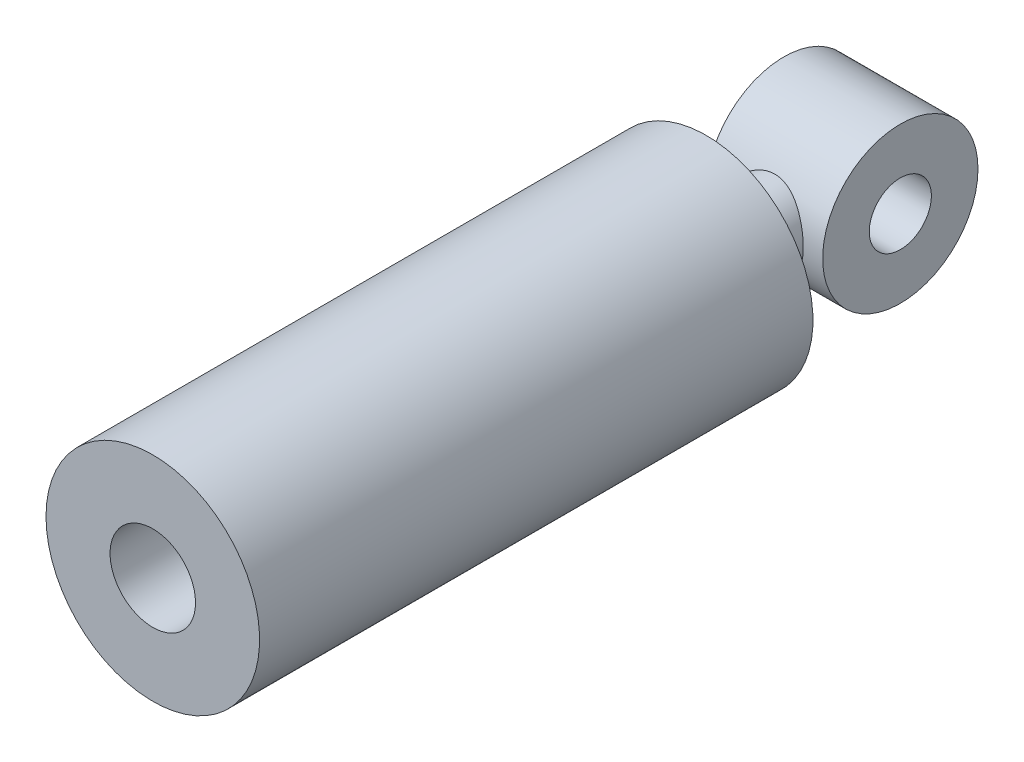
ISO-10303-21;
HEADER;
FILE_DESCRIPTION(('STEP AP214'),'2;1');
FILE_NAME('part.step','',(''),(''),'','','');
FILE_SCHEMA(('AUTOMOTIVE_DESIGN { 1 0 10303 214 1 1 1 1 }'));
ENDSEC;
DATA;
#1=APPLICATION_CONTEXT('core data for automotive mechanical design processes');
#2=APPLICATION_PROTOCOL_DEFINITION('international standard','automotive_design',2000,#1);
#3=PRODUCT_CONTEXT('',#1,'mechanical');
#4=PRODUCT('Part','Part','',(#3));
#5=PRODUCT_RELATED_PRODUCT_CATEGORY('part','',(#4));
#6=PRODUCT_DEFINITION_FORMATION('','',#4);
#7=PRODUCT_DEFINITION_CONTEXT('part definition',#1,'design');
#8=PRODUCT_DEFINITION('design','',#6,#7);
#9=PRODUCT_DEFINITION_SHAPE('','',#8);
#10=(LENGTH_UNIT() NAMED_UNIT(*) SI_UNIT(.MILLI.,.METRE.));
#11=(NAMED_UNIT(*) PLANE_ANGLE_UNIT() SI_UNIT($,.RADIAN.));
#12=(NAMED_UNIT(*) SI_UNIT($,.STERADIAN.) SOLID_ANGLE_UNIT());
#13=UNCERTAINTY_MEASURE_WITH_UNIT(LENGTH_MEASURE(1.E-05),#10,'distance_accuracy_value','');
#14=(GEOMETRIC_REPRESENTATION_CONTEXT(3) GLOBAL_UNCERTAINTY_ASSIGNED_CONTEXT((#13)) GLOBAL_UNIT_ASSIGNED_CONTEXT((#10,
#11,#12)) REPRESENTATION_CONTEXT('',''));
#15=CARTESIAN_POINT('',(0.,0.,0.));
#16=DIRECTION('',(0.,0.,1.));
#17=DIRECTION('',(1.,0.,0.));
#18=AXIS2_PLACEMENT_3D('',#15,#16,#17);
#19=CARTESIAN_POINT('',(0.,0.,9.));
#20=DIRECTION('',(0.,0.,-1.));
#21=DIRECTION('',(-1.,0.,0.));
#22=AXIS2_PLACEMENT_3D('',#19,#20,#21);
#23=CYLINDRICAL_SURFACE('',#22,2.);
#24=CARTESIAN_POINT('',(0.,0.,7.));
#25=DIRECTION('',(0.,0.,1.));
#26=DIRECTION('',(1.,0.,0.));
#27=AXIS2_PLACEMENT_3D('',#24,#25,#26);
#28=CIRCLE('',#27,2.);
#29=CARTESIAN_POINT('',(2.,0.,7.));
#30=VERTEX_POINT('',#29);
#31=EDGE_CURVE('E49',#30,#30,#28,.F.);
#32=ORIENTED_EDGE('',*,*,#31,.T.);
#33=EDGE_LOOP('',(#32));
#34=FACE_BOUND('',#33,.T.);
#35=CARTESIAN_POINT('',(-2.,0.,4.));
#36=CARTESIAN_POINT('',(-1.99999339536562,0.105143925902467,3.99999426810082));
#37=CARTESIAN_POINT('',(-1.99165985375789,0.210413199395125,3.99580982039513));
#38=CARTESIAN_POINT('',(-1.95869423931692,0.417840470537792,3.97948312074314));
#39=CARTESIAN_POINT('',(-1.93403121400437,0.519992173427259,3.96732575657839));
#40=CARTESIAN_POINT('',(-1.86961238276674,0.717867089760898,3.93632558806751));
#41=CARTESIAN_POINT('',(-1.82991523150406,0.813613605878292,3.91750878355075));
#42=CARTESIAN_POINT('',(-1.73685875727003,0.996945233613197,3.87491553031523));
#43=CARTESIAN_POINT('',(-1.68350051150227,1.08453098798012,3.8511394726705));
#44=CARTESIAN_POINT('',(-1.56096550102943,1.25501563552382,3.79912516516124));
#45=CARTESIAN_POINT('',(-1.49102704152072,1.33731042224422,3.77070398255074));
#46=CARTESIAN_POINT('',(-1.33895704150593,1.48955888973396,3.71319940493486));
#47=CARTESIAN_POINT('',(-1.25681629645512,1.55950316621353,3.68411552418069));
#48=CARTESIAN_POINT('',(-1.07503330095324,1.69050400090056,3.62597902394695));
#49=CARTESIAN_POINT('',(-0.974527803308175,1.75045067110327,3.59710373940264));
#50=CARTESIAN_POINT('',(-0.763265328027571,1.85233645378139,3.54571957544641));
#51=CARTESIAN_POINT('',(-0.652515742554502,1.89428842993267,3.52320615213979));
#52=CARTESIAN_POINT('',(-0.430669789156155,1.95626488437718,3.48915734075617));
#53=CARTESIAN_POINT('',(-0.319991095865212,1.97745171416088,3.47704543167427));
#54=CARTESIAN_POINT('',(-0.0960423244410465,2.00085398661769,3.46363779897055));
#55=CARTESIAN_POINT('',(0.0172250817423094,2.00308817674615,3.46233138686576));
#56=CARTESIAN_POINT('',(0.228572048630736,1.98937457434459,3.47021860514497));
#57=CARTESIAN_POINT('',(0.3268480624461,1.97556911907364,3.47817527324027));
#58=CARTESIAN_POINT('',(0.519443818746084,1.93387969811386,3.50152457467701));
#59=CARTESIAN_POINT('',(0.613762290610631,1.9059912477953,3.51691957663553));
#60=CARTESIAN_POINT('',(0.798458265131319,1.83641956077201,3.55374952825482));
#61=CARTESIAN_POINT('',(0.888692797571578,1.79443013423199,3.57531681327997));
#62=CARTESIAN_POINT('',(1.06126858518002,1.698083375336,3.62206808562807));
#63=CARTESIAN_POINT('',(1.14360627120018,1.64372048762493,3.64725369560381));
#64=CARTESIAN_POINT('',(1.30904250548645,1.51613210982558,3.70226315806572));
#65=CARTESIAN_POINT('',(1.39091374715231,1.44138891673856,3.73227020473492));
#66=CARTESIAN_POINT('',(1.5414708371818,1.27911115748275,3.79095246600814));
#67=CARTESIAN_POINT('',(1.61015038406777,1.19157051314857,3.81962703917602));
#68=CARTESIAN_POINT('',(1.73537132205945,1.0010330116637,3.87403974565928));
#69=CARTESIAN_POINT('',(1.79120094489148,0.897507183198817,3.89957968324015));
#70=CARTESIAN_POINT('',(1.88419405808602,0.680932430977593,3.94315762242485));
#71=CARTESIAN_POINT('',(1.92137237003033,0.567891152530551,3.96120157887106));
#72=CARTESIAN_POINT('',(1.97295080743335,0.345532983321404,3.98648667482871));
#73=CARTESIAN_POINT('',(1.98898247149356,0.236683061096652,3.9944987660262));
#74=CARTESIAN_POINT('',(2.00292946226897,0.0175591998987035,4.00146026918207));
#75=CARTESIAN_POINT('',(2.00085337127894,-0.0927140397398173,4.00041397442637));
#76=CARTESIAN_POINT('',(1.97958662316251,-0.302465943971974,3.9898238450687));
#77=CARTESIAN_POINT('',(1.96173493454001,-0.40211881609986,3.98094491376337));
#78=CARTESIAN_POINT('',(1.91152385620976,-0.596813784603882,3.9564434262968));
#79=CARTESIAN_POINT('',(1.87916286709301,-0.691855371382174,3.94082012668824));
#80=CARTESIAN_POINT('',(1.80000306713393,-0.877777216899146,3.90368502827176));
#81=CARTESIAN_POINT('',(1.75281789976743,-0.968460794011607,3.88201763539262));
#82=CARTESIAN_POINT('',(1.64578492870686,-1.14092272339854,3.83487948634835));
#83=CARTESIAN_POINT('',(1.58593173080921,-1.22269725955318,3.80940711133877));
#84=CARTESIAN_POINT('',(1.44847914933857,-1.38353537857843,3.75416442672396));
#85=CARTESIAN_POINT('',(1.36971426310971,-1.46154415563805,3.72421769686998));
#86=CARTESIAN_POINT('',(1.20014969744454,-1.60371264223771,3.6652478321764));
#87=CARTESIAN_POINT('',(1.10934176230416,-1.66786277142375,3.63622534800094));
#88=CARTESIAN_POINT('',(0.912712691654048,-1.78341582895804,3.58102384412979));
#89=CARTESIAN_POINT('',(0.806377467811036,-1.8340509916005,3.55505059178121));
#90=CARTESIAN_POINT('',(0.584979864850067,-1.91616565186941,3.51148144588269));
#91=CARTESIAN_POINT('',(0.469928947066219,-1.94766983173403,3.493874764435));
#92=CARTESIAN_POINT('',(0.24617955423059,-1.98772337493374,3.47123002051604));
#93=CARTESIAN_POINT('',(0.137931493129515,-1.9981859928109,3.4651476693013));
#94=CARTESIAN_POINT('',(-0.0788941343290512,-2.0013783087524,3.46330709283207));
#95=CARTESIAN_POINT('',(-0.187471537475724,-1.99411569324648,3.4675443925278));
#96=CARTESIAN_POINT('',(-0.390967003066875,-1.96385225118662,3.48475724102153));
#97=CARTESIAN_POINT('',(-0.48620094028948,-1.94241662868607,3.49686188965317));
#98=CARTESIAN_POINT('',(-0.671616238848734,-1.88635071644882,3.52742032375305));
#99=CARTESIAN_POINT('',(-0.761795964184064,-1.85171618231984,3.54587615139337));
#100=CARTESIAN_POINT('',(-0.941249701973074,-1.76763149060113,3.58857060729071));
#101=CARTESIAN_POINT('',(-1.03005580365806,-1.7173422756314,3.61311444791841));
#102=CARTESIAN_POINT('',(-1.19854907236252,-1.60430194327478,3.66470663269721));
#103=CARTESIAN_POINT('',(-1.27823146104222,-1.54154434248312,3.69175627591221));
#104=CARTESIAN_POINT('',(-1.43628396470935,-1.39640665332275,3.74924646316184));
#105=CARTESIAN_POINT('',(-1.51331820470058,-1.31256884599452,3.77969966613256));
#106=CARTESIAN_POINT('',(-1.65252596687054,-1.13230961246639,3.83755504519861));
#107=CARTESIAN_POINT('',(-1.71469147893981,-1.03588144661039,3.8649555725239));
#108=CARTESIAN_POINT('',(-1.82247272542414,-0.831863193565889,3.91396019133075));
#109=CARTESIAN_POINT('',(-1.86796833847294,-0.724199007553459,3.93552192987866));
#110=CARTESIAN_POINT('',(-1.93961633551482,-0.501484202276171,3.97002682597974));
#111=CARTESIAN_POINT('',(-1.96582369361143,-0.386455599178198,3.98299446726136));
#112=CARTESIAN_POINT('',(-1.98779482217148,-0.22520389298179,3.99390923826956));
#113=CARTESIAN_POINT('',(-1.99236528173268,-0.180323758883129,3.99618730680502));
#114=CARTESIAN_POINT('',(-1.99846933102817,-0.0903034636101833,3.99923393953631));
#115=CARTESIAN_POINT('',(-2.00000283694042,-0.0451632952932569,4.00000246206762));
#116=CARTESIAN_POINT('',(-2.,0.,4.));
#117=B_SPLINE_CURVE_WITH_KNOTS('',3,(#35,#36,#37,#38,#39,#40,#41,#42,#43,#44,#45,#46,#47,#48,
#49,#50,#51,#52,#53,#54,#55,#56,#57,#58,#59,#60,#61,#62,#63,#64,#65,#66,#67,#68,#69,#70,#71,#72,
#73,#74,#75,#76,#77,#78,#79,#80,#81,#82,#83,#84,#85,#86,#87,#88,#89,#90,#91,#92,#93,#94,#95,#96,
#97,#98,#99,#100,#101,#102,#103,#104,#105,#106,#107,#108,#109,#110,#111,#112,#113,#114,#115,
#116),.UNSPECIFIED.,.T.,.F.,(4,2,2,2,2,2,2,2,2,2,2,2,2,2,2,2,2,2,2,2,2,2,2,2,2,2,2,2,2,2,2,2,2,
2,2,2,2,2,2,2,4),(0.,0.315248514840585,0.631096299418395,0.945724310984597,1.26032752116314,
1.59396351743618,1.92785247530807,2.28763452861505,2.64715895796562,2.98516024280459,
3.32282714658041,3.62011424818641,3.91749607851357,4.22180480336975,4.52625042520444,
4.86929882667757,5.21251069197373,5.57166044428881,5.93052433824559,6.25966580942691,
6.58865129022952,6.89213813012244,7.19565843261863,7.50785712055797,7.82018901496678,
8.16319221288838,8.50643177230863,8.86629364323451,9.22569023890901,9.55058615006093,
9.87534119729357,10.1691586049771,10.463070575767,10.7767291356057,11.0905512228726,
11.4425048551434,11.7946476676249,12.1492802732705,12.502898172423,12.6383056026783,
12.7737167702213),.UNSPECIFIED.);
#118=CARTESIAN_POINT('',(-2.,0.,4.));
#119=VERTEX_POINT('',#118);
#120=EDGE_CURVE('E10',#119,#119,#117,.T.);
#121=ORIENTED_EDGE('',*,*,#120,.F.);
#122=EDGE_LOOP('',(#121));
#123=FACE_BOUND('',#122,.T.);
#124=ADVANCED_FACE('F41',(#34,#123),#23,.T.);
#125=CARTESIAN_POINT('',(0.,0.,35.5));
#126=DIRECTION('',(0.,0.,-1.));
#127=DIRECTION('',(-1.,0.,0.));
#128=AXIS2_PLACEMENT_3D('',#125,#126,#127);
#129=CYLINDRICAL_SURFACE('',#128,5.5);
#130=CARTESIAN_POINT('',(0.,0.,35.5));
#131=DIRECTION('',(0.,0.,1.));
#132=DIRECTION('',(1.,0.,0.));
#133=AXIS2_PLACEMENT_3D('',#130,#131,#132);
#134=CIRCLE('',#133,5.5);
#135=CARTESIAN_POINT('',(-5.5,0.,35.5));
#136=VERTEX_POINT('',#135);
#137=EDGE_CURVE('E53',#136,#136,#134,.T.);
#138=CARTESIAN_POINT('',(0.,0.,7.));
#139=DIRECTION('',(0.,0.,1.));
#140=DIRECTION('',(1.,0.,0.));
#141=AXIS2_PLACEMENT_3D('',#138,#139,#140);
#142=CIRCLE('',#141,5.5);
#143=CARTESIAN_POINT('',(-5.5,0.,7.));
#144=VERTEX_POINT('',#143);
#145=EDGE_CURVE('E100',#144,#144,#142,.T.);
#146=CARTESIAN_POINT('',(-5.5,0.,35.5));
#147=CARTESIAN_POINT('',(-5.5,0.,35.203125));
#148=CARTESIAN_POINT('',(-5.5,0.,34.90625));
#149=CARTESIAN_POINT('',(-5.5,0.,34.3125));
#150=CARTESIAN_POINT('',(-5.5,0.,34.015625));
#151=CARTESIAN_POINT('',(-5.5,0.,33.421875));
#152=CARTESIAN_POINT('',(-5.5,0.,33.125));
#153=CARTESIAN_POINT('',(-5.5,0.,32.53125));
#154=CARTESIAN_POINT('',(-5.5,0.,32.234375));
#155=CARTESIAN_POINT('',(-5.5,0.,31.640625));
#156=CARTESIAN_POINT('',(-5.5,0.,31.34375));
#157=CARTESIAN_POINT('',(-5.5,0.,30.75));
#158=CARTESIAN_POINT('',(-5.5,0.,30.453125));
#159=CARTESIAN_POINT('',(-5.5,0.,29.859375));
#160=CARTESIAN_POINT('',(-5.5,0.,29.5625));
#161=CARTESIAN_POINT('',(-5.5,0.,28.96875));
#162=CARTESIAN_POINT('',(-5.5,0.,28.671875));
#163=CARTESIAN_POINT('',(-5.5,0.,28.078125));
#164=CARTESIAN_POINT('',(-5.5,0.,27.78125));
#165=CARTESIAN_POINT('',(-5.5,0.,27.1875));
#166=CARTESIAN_POINT('',(-5.5,0.,26.890625));
#167=CARTESIAN_POINT('',(-5.5,0.,26.296875));
#168=CARTESIAN_POINT('',(-5.5,0.,26.));
#169=CARTESIAN_POINT('',(-5.5,0.,25.40625));
#170=CARTESIAN_POINT('',(-5.5,0.,25.109375));
#171=CARTESIAN_POINT('',(-5.5,0.,24.515625));
#172=CARTESIAN_POINT('',(-5.5,0.,24.21875));
#173=CARTESIAN_POINT('',(-5.5,0.,23.625));
#174=CARTESIAN_POINT('',(-5.5,0.,23.328125));
#175=CARTESIAN_POINT('',(-5.5,0.,22.734375));
#176=CARTESIAN_POINT('',(-5.5,0.,22.4375));
#177=CARTESIAN_POINT('',(-5.5,0.,21.84375));
#178=CARTESIAN_POINT('',(-5.5,0.,21.546875));
#179=CARTESIAN_POINT('',(-5.5,0.,20.953125));
#180=CARTESIAN_POINT('',(-5.5,0.,20.65625));
#181=CARTESIAN_POINT('',(-5.5,0.,20.0625));
#182=CARTESIAN_POINT('',(-5.5,0.,19.765625));
#183=CARTESIAN_POINT('',(-5.5,0.,19.171875));
#184=CARTESIAN_POINT('',(-5.5,0.,18.875));
#185=CARTESIAN_POINT('',(-5.5,0.,18.28125));
#186=CARTESIAN_POINT('',(-5.5,0.,17.984375));
#187=CARTESIAN_POINT('',(-5.5,0.,17.390625));
#188=CARTESIAN_POINT('',(-5.5,0.,17.09375));
#189=CARTESIAN_POINT('',(-5.5,0.,16.5));
#190=CARTESIAN_POINT('',(-5.5,0.,16.203125));
#191=CARTESIAN_POINT('',(-5.5,0.,15.609375));
#192=CARTESIAN_POINT('',(-5.5,0.,15.3125));
#193=CARTESIAN_POINT('',(-5.5,0.,14.71875));
#194=CARTESIAN_POINT('',(-5.5,0.,14.421875));
#195=CARTESIAN_POINT('',(-5.5,0.,13.828125));
#196=CARTESIAN_POINT('',(-5.5,0.,13.53125));
#197=CARTESIAN_POINT('',(-5.5,0.,12.9375));
#198=CARTESIAN_POINT('',(-5.5,0.,12.640625));
#199=CARTESIAN_POINT('',(-5.5,0.,12.046875));
#200=CARTESIAN_POINT('',(-5.5,0.,11.75));
#201=CARTESIAN_POINT('',(-5.5,0.,11.15625));
#202=CARTESIAN_POINT('',(-5.5,0.,10.859375));
#203=CARTESIAN_POINT('',(-5.5,0.,10.265625));
#204=CARTESIAN_POINT('',(-5.5,0.,9.96875));
#205=CARTESIAN_POINT('',(-5.5,0.,9.375));
#206=CARTESIAN_POINT('',(-5.5,0.,9.07812500000001));
#207=CARTESIAN_POINT('',(-5.5,0.,8.484375));
#208=CARTESIAN_POINT('',(-5.5,0.,8.1875));
#209=CARTESIAN_POINT('',(-5.5,0.,7.59375));
#210=CARTESIAN_POINT('',(-5.5,0.,7.296875));
#211=CARTESIAN_POINT('',(-5.5,0.,7.));
#212=B_SPLINE_CURVE_WITH_KNOTS('',3,(#146,#147,#148,#149,#150,#151,#152,#153,#154,#155,#156,
#157,#158,#159,#160,#161,#162,#163,#164,#165,#166,#167,#168,#169,#170,#171,#172,#173,#174,#175,
#176,#177,#178,#179,#180,#181,#182,#183,#184,#185,#186,#187,#188,#189,#190,#191,#192,#193,#194,
#195,#196,#197,#198,#199,#200,#201,#202,#203,#204,#205,#206,#207,#208,#209,#210,#211),
.UNSPECIFIED.,.F.,.F.,(4,2,2,2,2,2,2,2,2,2,2,2,2,2,2,2,2,2,2,2,2,2,2,2,2,2,2,2,2,2,2,2,4),(0.,
0.890625000000006,1.78125000000001,2.671875,3.5625,4.453125,5.34375,6.234375,7.125,8.015625,
8.90625,9.796875,10.6875,11.578125,12.46875,13.359375,14.25,15.140625,16.03125,16.921875,
17.8125,18.703125,19.59375,20.484375,21.375,22.265625,23.15625,24.046875,24.9375,25.828125,
26.71875,27.609375,28.5),.UNSPECIFIED.);
#213=EDGE_CURVE('BSEAM43',#136,#144,#212,.T.);
#214=ORIENTED_EDGE('',*,*,#137,.F.);
#215=ORIENTED_EDGE('',*,*,#145,.T.);
#216=ORIENTED_EDGE('',*,*,#213,.T.);
#217=ORIENTED_EDGE('',*,*,#213,.F.);
#218=EDGE_LOOP('',(#214,#216,#215,#217));
#219=FACE_BOUND('',#218,.T.);
#220=ADVANCED_FACE('F43',(#219),#129,.T.);
#221=CARTESIAN_POINT('',(0.,0.,35.5));
#222=DIRECTION('',(0.,0.,1.));
#223=DIRECTION('',(1.,0.,0.));
#224=AXIS2_PLACEMENT_3D('',#221,#222,#223);
#225=PLANE('',#224);
#226=CARTESIAN_POINT('',(0.,0.,35.5));
#227=DIRECTION('',(0.,0.,1.));
#228=DIRECTION('',(1.,0.,0.));
#229=AXIS2_PLACEMENT_3D('',#226,#227,#228);
#230=CIRCLE('',#229,2.2);
#231=CARTESIAN_POINT('',(2.2,0.,35.5));
#232=VERTEX_POINT('',#231);
#233=EDGE_CURVE('E102',#232,#232,#230,.F.);
#234=ORIENTED_EDGE('',*,*,#233,.T.);
#235=EDGE_LOOP('',(#234));
#236=FACE_BOUND('',#235,.T.);
#237=ORIENTED_EDGE('',*,*,#137,.T.);
#238=EDGE_LOOP('',(#237));
#239=FACE_BOUND('',#238,.T.);
#240=ADVANCED_FACE('F89',(#236,#239),#225,.T.);
#241=CARTESIAN_POINT('',(0.,0.,7.));
#242=DIRECTION('',(0.,0.,1.));
#243=DIRECTION('',(1.,0.,0.));
#244=AXIS2_PLACEMENT_3D('',#241,#242,#243);
#245=PLANE('',#244);
#246=ORIENTED_EDGE('',*,*,#31,.F.);
#247=EDGE_LOOP('',(#246));
#248=FACE_BOUND('',#247,.T.);
#249=ORIENTED_EDGE('',*,*,#145,.F.);
#250=EDGE_LOOP('',(#249));
#251=FACE_BOUND('',#250,.T.);
#252=ADVANCED_FACE('F94',(#248,#251),#245,.F.);
#253=CARTESIAN_POINT('',(0.,0.,36.5));
#254=DIRECTION('',(0.,0.,-1.));
#255=DIRECTION('',(-1.,0.,0.));
#256=AXIS2_PLACEMENT_3D('',#253,#254,#255);
#257=CYLINDRICAL_SURFACE('',#256,2.2);
#258=ORIENTED_EDGE('',*,*,#233,.F.);
#259=EDGE_LOOP('',(#258));
#260=FACE_BOUND('',#259,.T.);
#261=CARTESIAN_POINT('',(0.,0.,12.));
#262=DIRECTION('',(0.,0.,1.));
#263=DIRECTION('',(1.,0.,0.));
#264=AXIS2_PLACEMENT_3D('',#261,#262,#263);
#265=CIRCLE('',#264,2.2);
#266=CARTESIAN_POINT('',(2.2,0.,12.));
#267=VERTEX_POINT('',#266);
#268=EDGE_CURVE('E107',#267,#267,#265,.T.);
#269=ORIENTED_EDGE('',*,*,#268,.F.);
#270=EDGE_LOOP('',(#269));
#271=FACE_BOUND('',#270,.T.);
#272=ADVANCED_FACE('F97',(#260,#271),#257,.F.);
#273=CARTESIAN_POINT('',(0.,0.,12.));
#274=DIRECTION('',(0.,0.,1.));
#275=DIRECTION('',(1.,0.,0.));
#276=AXIS2_PLACEMENT_3D('',#273,#274,#275);
#277=PLANE('',#276);
#278=ORIENTED_EDGE('',*,*,#268,.T.);
#279=EDGE_LOOP('',(#278));
#280=FACE_BOUND('',#279,.T.);
#281=ADVANCED_FACE('F68',(#280),#277,.T.);
#282=CARTESIAN_POINT('',(3.,0.,0.));
#283=DIRECTION('',(-1.,0.,0.));
#284=DIRECTION('',(0.,0.,1.));
#285=AXIS2_PLACEMENT_3D('',#282,#283,#284);
#286=CYLINDRICAL_SURFACE('',#285,4.);
#287=CARTESIAN_POINT('',(-3.,0.,0.));
#288=DIRECTION('',(1.,0.,0.));
#289=DIRECTION('',(0.,0.,-1.));
#290=AXIS2_PLACEMENT_3D('',#287,#288,#289);
#291=CIRCLE('',#290,4.);
#292=CARTESIAN_POINT('',(-3.,0.,-4.));
#293=VERTEX_POINT('',#292);
#294=EDGE_CURVE('E112',#293,#293,#291,.T.);
#295=ORIENTED_EDGE('',*,*,#294,.T.);
#296=EDGE_LOOP('',(#295));
#297=FACE_BOUND('',#296,.T.);
#298=CARTESIAN_POINT('',(3.,0.,0.));
#299=DIRECTION('',(1.,0.,0.));
#300=DIRECTION('',(0.,0.,-1.));
#301=AXIS2_PLACEMENT_3D('',#298,#299,#300);
#302=CIRCLE('',#301,4.);
#303=CARTESIAN_POINT('',(3.,0.,-4.));
#304=VERTEX_POINT('',#303);
#305=EDGE_CURVE('E111',#304,#304,#302,.T.);
#306=ORIENTED_EDGE('',*,*,#305,.F.);
#307=EDGE_LOOP('',(#306));
#308=FACE_BOUND('',#307,.T.);
#309=ORIENTED_EDGE('',*,*,#120,.T.);
#310=EDGE_LOOP('',(#309));
#311=FACE_BOUND('',#310,.T.);
#312=ADVANCED_FACE('F63',(#297,#308,#311),#286,.T.);
#313=CARTESIAN_POINT('',(3.,0.,0.));
#314=DIRECTION('',(1.,0.,0.));
#315=DIRECTION('',(0.,0.,-1.));
#316=AXIS2_PLACEMENT_3D('',#313,#314,#315);
#317=PLANE('',#316);
#318=CARTESIAN_POINT('',(3.,0.,0.));
#319=DIRECTION('',(1.,0.,0.));
#320=DIRECTION('',(0.,0.,-1.));
#321=AXIS2_PLACEMENT_3D('',#318,#319,#320);
#322=CIRCLE('',#321,1.6);
#323=CARTESIAN_POINT('',(3.,0.,-1.6));
#324=VERTEX_POINT('',#323);
#325=EDGE_CURVE('E115',#324,#324,#322,.F.);
#326=ORIENTED_EDGE('',*,*,#325,.T.);
#327=EDGE_LOOP('',(#326));
#328=FACE_BOUND('',#327,.T.);
#329=ORIENTED_EDGE('',*,*,#305,.T.);
#330=EDGE_LOOP('',(#329));
#331=FACE_BOUND('',#330,.T.);
#332=ADVANCED_FACE('F67',(#328,#331),#317,.T.);
#333=CARTESIAN_POINT('',(-3.,0.,0.));
#334=DIRECTION('',(1.,0.,0.));
#335=DIRECTION('',(0.,0.,-1.));
#336=AXIS2_PLACEMENT_3D('',#333,#334,#335);
#337=PLANE('',#336);
#338=CARTESIAN_POINT('',(-3.,0.,0.));
#339=DIRECTION('',(1.,0.,0.));
#340=DIRECTION('',(0.,0.,-1.));
#341=AXIS2_PLACEMENT_3D('',#338,#339,#340);
#342=CIRCLE('',#341,1.6);
#343=CARTESIAN_POINT('',(-3.,0.,-1.6));
#344=VERTEX_POINT('',#343);
#345=EDGE_CURVE('E45',#344,#344,#342,.F.);
#346=ORIENTED_EDGE('',*,*,#345,.F.);
#347=EDGE_LOOP('',(#346));
#348=FACE_BOUND('',#347,.T.);
#349=ORIENTED_EDGE('',*,*,#294,.F.);
#350=EDGE_LOOP('',(#349));
#351=FACE_BOUND('',#350,.T.);
#352=ADVANCED_FACE('F70',(#348,#351),#337,.F.);
#353=CARTESIAN_POINT('',(4.,0.,0.));
#354=DIRECTION('',(-1.,0.,0.));
#355=DIRECTION('',(0.,0.,1.));
#356=AXIS2_PLACEMENT_3D('',#353,#354,#355);
#357=CYLINDRICAL_SURFACE('',#356,1.6);
#358=ORIENTED_EDGE('',*,*,#325,.F.);
#359=EDGE_LOOP('',(#358));
#360=FACE_BOUND('',#359,.T.);
#361=ORIENTED_EDGE('',*,*,#345,.T.);
#362=EDGE_LOOP('',(#361));
#363=FACE_BOUND('',#362,.T.);
#364=ADVANCED_FACE('F73',(#360,#363),#357,.F.);
#365=CLOSED_SHELL('',(#124,#220,#240,#252,#272,#281,#312,#332,#352,#364));
#366=MANIFOLD_SOLID_BREP('B2',#365);
#367=ADVANCED_BREP_SHAPE_REPRESENTATION('',(#18,#366),#14);
#368=SHAPE_DEFINITION_REPRESENTATION(#9,#367);
ENDSEC;
END-ISO-10303-21;
